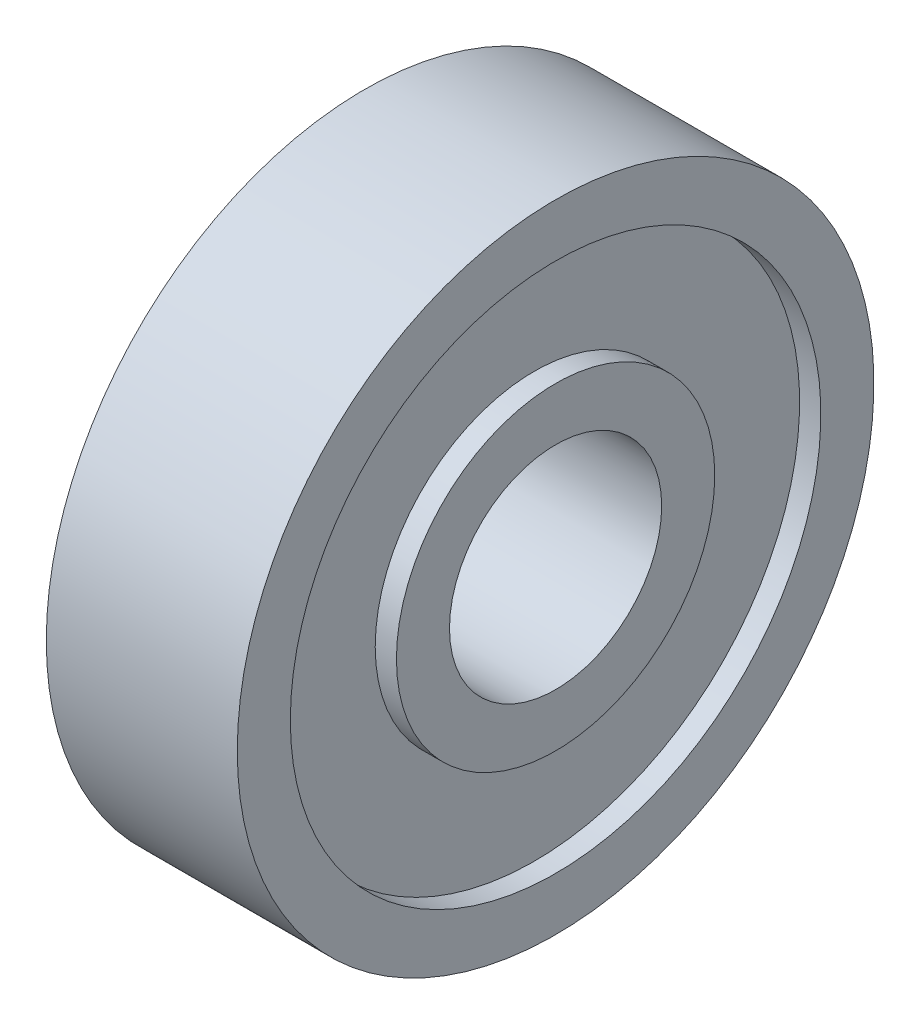
ISO-10303-21;
HEADER;
FILE_DESCRIPTION(('STEP AP214'),'2;1');
FILE_NAME('part.step','',(''),(''),'','','');
FILE_SCHEMA(('AUTOMOTIVE_DESIGN { 1 0 10303 214 1 1 1 1 }'));
ENDSEC;
DATA;
#1=APPLICATION_CONTEXT('core data for automotive mechanical design processes');
#2=APPLICATION_PROTOCOL_DEFINITION('international standard','automotive_design',2000,#1);
#3=PRODUCT_CONTEXT('',#1,'mechanical');
#4=PRODUCT('Part','Part','',(#3));
#5=PRODUCT_RELATED_PRODUCT_CATEGORY('part','',(#4));
#6=PRODUCT_DEFINITION_FORMATION('','',#4);
#7=PRODUCT_DEFINITION_CONTEXT('part definition',#1,'design');
#8=PRODUCT_DEFINITION('design','',#6,#7);
#9=PRODUCT_DEFINITION_SHAPE('','',#8);
#10=(LENGTH_UNIT() NAMED_UNIT(*) SI_UNIT(.MILLI.,.METRE.));
#11=(NAMED_UNIT(*) PLANE_ANGLE_UNIT() SI_UNIT($,.RADIAN.));
#12=(NAMED_UNIT(*) SI_UNIT($,.STERADIAN.) SOLID_ANGLE_UNIT());
#13=UNCERTAINTY_MEASURE_WITH_UNIT(LENGTH_MEASURE(1.E-05),#10,'distance_accuracy_value','');
#14=(GEOMETRIC_REPRESENTATION_CONTEXT(3) GLOBAL_UNCERTAINTY_ASSIGNED_CONTEXT((#13)) GLOBAL_UNIT_ASSIGNED_CONTEXT((#10,
#11,#12)) REPRESENTATION_CONTEXT('',''));
#15=CARTESIAN_POINT('',(0.,0.,0.));
#16=DIRECTION('',(0.,0.,1.));
#17=DIRECTION('',(1.,0.,0.));
#18=AXIS2_PLACEMENT_3D('',#15,#16,#17);
#19=CARTESIAN_POINT('',(-243.027564124036,0.,0.));
#20=DIRECTION('',(-1.,0.,0.));
#21=DIRECTION('',(0.,0.,1.));
#22=AXIS2_PLACEMENT_3D('',#19,#20,#21);
#23=CYLINDRICAL_SURFACE('',#22,5.00000000000024);
#24=CARTESIAN_POINT('',(4.5,0.,0.));
#25=DIRECTION('',(-1.,0.,0.));
#26=DIRECTION('',(0.,0.,1.));
#27=AXIS2_PLACEMENT_3D('',#24,#25,#26);
#28=CIRCLE('',#27,5.);
#29=CARTESIAN_POINT('',(4.5,0.,5.));
#30=VERTEX_POINT('',#29);
#31=EDGE_CURVE('E10',#30,#30,#28,.T.);
#32=ORIENTED_EDGE('',*,*,#31,.F.);
#33=EDGE_LOOP('',(#32));
#34=FACE_BOUND('',#33,.T.);
#35=CARTESIAN_POINT('',(-4.5,0.,0.));
#36=DIRECTION('',(-1.,0.,0.));
#37=DIRECTION('',(0.,0.,1.));
#38=AXIS2_PLACEMENT_3D('',#35,#36,#37);
#39=CIRCLE('',#38,5.);
#40=CARTESIAN_POINT('',(-4.5,0.,5.));
#41=VERTEX_POINT('',#40);
#42=EDGE_CURVE('E74',#41,#41,#39,.T.);
#43=ORIENTED_EDGE('',*,*,#42,.T.);
#44=EDGE_LOOP('',(#43));
#45=FACE_BOUND('',#44,.T.);
#46=ADVANCED_FACE('F43',(#34,#45),#23,.F.);
#47=CARTESIAN_POINT('',(4.5,5.,0.));
#48=DIRECTION('',(-1.,0.,0.));
#49=DIRECTION('',(0.,0.,1.));
#50=AXIS2_PLACEMENT_3D('',#47,#48,#49);
#51=PLANE('',#50);
#52=CARTESIAN_POINT('',(4.5,0.,0.));
#53=DIRECTION('',(-1.,0.,0.));
#54=DIRECTION('',(0.,0.,1.));
#55=AXIS2_PLACEMENT_3D('',#52,#53,#54);
#56=CIRCLE('',#55,7.5);
#57=CARTESIAN_POINT('',(4.5,0.,7.5));
#58=VERTEX_POINT('',#57);
#59=EDGE_CURVE('E50',#58,#58,#56,.T.);
#60=ORIENTED_EDGE('',*,*,#59,.F.);
#61=EDGE_LOOP('',(#60));
#62=FACE_BOUND('',#61,.T.);
#63=ORIENTED_EDGE('',*,*,#31,.T.);
#64=EDGE_LOOP('',(#63));
#65=FACE_BOUND('',#64,.T.);
#66=ADVANCED_FACE('F119',(#62,#65),#51,.F.);
#67=CARTESIAN_POINT('',(-243.027564124036,0.,0.));
#68=DIRECTION('',(-1.,0.,0.));
#69=DIRECTION('',(0.,0.,1.));
#70=AXIS2_PLACEMENT_3D('',#67,#68,#69);
#71=CYLINDRICAL_SURFACE('',#70,7.5);
#72=CARTESIAN_POINT('',(3.5,0.,0.));
#73=DIRECTION('',(-1.,0.,0.));
#74=DIRECTION('',(0.,0.,1.));
#75=AXIS2_PLACEMENT_3D('',#72,#73,#74);
#76=CIRCLE('',#75,7.5);
#77=CARTESIAN_POINT('',(3.5,0.,7.5));
#78=VERTEX_POINT('',#77);
#79=EDGE_CURVE('E55',#78,#78,#76,.T.);
#80=ORIENTED_EDGE('',*,*,#79,.F.);
#81=EDGE_LOOP('',(#80));
#82=FACE_BOUND('',#81,.T.);
#83=ORIENTED_EDGE('',*,*,#59,.T.);
#84=EDGE_LOOP('',(#83));
#85=FACE_BOUND('',#84,.T.);
#86=ADVANCED_FACE('F124',(#82,#85),#71,.T.);
#87=CARTESIAN_POINT('',(3.5,7.5,0.));
#88=DIRECTION('',(-1.,0.,0.));
#89=DIRECTION('',(0.,0.,1.));
#90=AXIS2_PLACEMENT_3D('',#87,#88,#89);
#91=PLANE('',#90);
#92=CARTESIAN_POINT('',(3.5,0.,0.));
#93=DIRECTION('',(-1.,0.,0.));
#94=DIRECTION('',(0.,0.,1.));
#95=AXIS2_PLACEMENT_3D('',#92,#93,#94);
#96=CIRCLE('',#95,12.5);
#97=CARTESIAN_POINT('',(3.5,0.,12.5));
#98=VERTEX_POINT('',#97);
#99=EDGE_CURVE('E60',#98,#98,#96,.T.);
#100=ORIENTED_EDGE('',*,*,#99,.F.);
#101=EDGE_LOOP('',(#100));
#102=FACE_BOUND('',#101,.T.);
#103=ORIENTED_EDGE('',*,*,#79,.T.);
#104=EDGE_LOOP('',(#103));
#105=FACE_BOUND('',#104,.T.);
#106=ADVANCED_FACE('F132',(#102,#105),#91,.F.);
#107=CARTESIAN_POINT('',(-243.027564124036,0.,0.));
#108=DIRECTION('',(-1.,0.,0.));
#109=DIRECTION('',(0.,0.,1.));
#110=AXIS2_PLACEMENT_3D('',#107,#108,#109);
#111=CYLINDRICAL_SURFACE('',#110,12.5);
#112=CARTESIAN_POINT('',(4.5,0.,0.));
#113=DIRECTION('',(-1.,0.,0.));
#114=DIRECTION('',(0.,0.,1.));
#115=AXIS2_PLACEMENT_3D('',#112,#113,#114);
#116=CIRCLE('',#115,12.5);
#117=CARTESIAN_POINT('',(4.5,0.,12.5));
#118=VERTEX_POINT('',#117);
#119=EDGE_CURVE('E66',#118,#118,#116,.T.);
#120=ORIENTED_EDGE('',*,*,#119,.F.);
#121=EDGE_LOOP('',(#120));
#122=FACE_BOUND('',#121,.T.);
#123=ORIENTED_EDGE('',*,*,#99,.T.);
#124=EDGE_LOOP('',(#123));
#125=FACE_BOUND('',#124,.T.);
#126=ADVANCED_FACE('F115',(#122,#125),#111,.F.);
#127=CARTESIAN_POINT('',(4.5,12.5,0.));
#128=DIRECTION('',(-1.,0.,0.));
#129=DIRECTION('',(0.,0.,1.));
#130=AXIS2_PLACEMENT_3D('',#127,#128,#129);
#131=PLANE('',#130);
#132=CARTESIAN_POINT('',(4.5,0.,0.));
#133=DIRECTION('',(-1.,0.,0.));
#134=DIRECTION('',(0.,0.,1.));
#135=AXIS2_PLACEMENT_3D('',#132,#133,#134);
#136=CIRCLE('',#135,15.);
#137=CARTESIAN_POINT('',(4.5,0.,15.));
#138=VERTEX_POINT('',#137);
#139=EDGE_CURVE('E70',#138,#138,#136,.T.);
#140=ORIENTED_EDGE('',*,*,#139,.F.);
#141=EDGE_LOOP('',(#140));
#142=FACE_BOUND('',#141,.T.);
#143=ORIENTED_EDGE('',*,*,#119,.T.);
#144=EDGE_LOOP('',(#143));
#145=FACE_BOUND('',#144,.T.);
#146=ADVANCED_FACE('F105',(#142,#145),#131,.F.);
#147=CARTESIAN_POINT('',(-243.027564124036,0.,0.));
#148=DIRECTION('',(-1.,0.,0.));
#149=DIRECTION('',(0.,0.,1.));
#150=AXIS2_PLACEMENT_3D('',#147,#148,#149);
#151=CYLINDRICAL_SURFACE('',#150,15.);
#152=ORIENTED_EDGE('',*,*,#139,.T.);
#153=EDGE_LOOP('',(#152));
#154=FACE_BOUND('',#153,.T.);
#155=CARTESIAN_POINT('',(-4.5,0.,0.));
#156=DIRECTION('',(-1.,0.,0.));
#157=DIRECTION('',(0.,0.,1.));
#158=AXIS2_PLACEMENT_3D('',#155,#156,#157);
#159=CIRCLE('',#158,15.);
#160=CARTESIAN_POINT('',(-4.5,0.,15.));
#161=VERTEX_POINT('',#160);
#162=EDGE_CURVE('E94',#161,#161,#159,.T.);
#163=ORIENTED_EDGE('',*,*,#162,.F.);
#164=EDGE_LOOP('',(#163));
#165=FACE_BOUND('',#164,.T.);
#166=ADVANCED_FACE('F102',(#154,#165),#151,.T.);
#167=CARTESIAN_POINT('',(-4.5,5.,0.));
#168=DIRECTION('',(1.,0.,0.));
#169=DIRECTION('',(0.,0.,1.));
#170=AXIS2_PLACEMENT_3D('',#167,#168,#169);
#171=PLANE('',#170);
#172=CARTESIAN_POINT('',(-4.5,0.,0.));
#173=DIRECTION('',(-1.,0.,0.));
#174=DIRECTION('',(0.,0.,1.));
#175=AXIS2_PLACEMENT_3D('',#172,#173,#174);
#176=CIRCLE('',#175,7.5);
#177=CARTESIAN_POINT('',(-4.5,0.,7.5));
#178=VERTEX_POINT('',#177);
#179=EDGE_CURVE('E78',#178,#178,#176,.T.);
#180=ORIENTED_EDGE('',*,*,#179,.T.);
#181=EDGE_LOOP('',(#180));
#182=FACE_BOUND('',#181,.T.);
#183=ORIENTED_EDGE('',*,*,#42,.F.);
#184=EDGE_LOOP('',(#183));
#185=FACE_BOUND('',#184,.T.);
#186=ADVANCED_FACE('F104',(#182,#185),#171,.F.);
#187=CARTESIAN_POINT('',(243.027564124036,0.,0.));
#188=DIRECTION('',(1.,0.,0.));
#189=DIRECTION('',(0.,0.,1.));
#190=AXIS2_PLACEMENT_3D('',#187,#188,#189);
#191=CYLINDRICAL_SURFACE('',#190,7.5);
#192=CARTESIAN_POINT('',(-3.5,0.,0.));
#193=DIRECTION('',(-1.,0.,0.));
#194=DIRECTION('',(0.,0.,1.));
#195=AXIS2_PLACEMENT_3D('',#192,#193,#194);
#196=CIRCLE('',#195,7.5);
#197=CARTESIAN_POINT('',(-3.5,0.,7.5));
#198=VERTEX_POINT('',#197);
#199=EDGE_CURVE('E82',#198,#198,#196,.T.);
#200=ORIENTED_EDGE('',*,*,#199,.T.);
#201=EDGE_LOOP('',(#200));
#202=FACE_BOUND('',#201,.T.);
#203=ORIENTED_EDGE('',*,*,#179,.F.);
#204=EDGE_LOOP('',(#203));
#205=FACE_BOUND('',#204,.T.);
#206=ADVANCED_FACE('F112',(#202,#205),#191,.T.);
#207=CARTESIAN_POINT('',(-3.5,7.5,0.));
#208=DIRECTION('',(1.,0.,0.));
#209=DIRECTION('',(0.,0.,1.));
#210=AXIS2_PLACEMENT_3D('',#207,#208,#209);
#211=PLANE('',#210);
#212=CARTESIAN_POINT('',(-3.5,0.,0.));
#213=DIRECTION('',(-1.,0.,0.));
#214=DIRECTION('',(0.,0.,1.));
#215=AXIS2_PLACEMENT_3D('',#212,#213,#214);
#216=CIRCLE('',#215,12.5);
#217=CARTESIAN_POINT('',(-3.5,0.,12.5));
#218=VERTEX_POINT('',#217);
#219=EDGE_CURVE('E86',#218,#218,#216,.T.);
#220=ORIENTED_EDGE('',*,*,#219,.T.);
#221=EDGE_LOOP('',(#220));
#222=FACE_BOUND('',#221,.T.);
#223=ORIENTED_EDGE('',*,*,#199,.F.);
#224=EDGE_LOOP('',(#223));
#225=FACE_BOUND('',#224,.T.);
#226=ADVANCED_FACE('F183',(#222,#225),#211,.F.);
#227=CARTESIAN_POINT('',(243.027564124036,0.,0.));
#228=DIRECTION('',(1.,0.,0.));
#229=DIRECTION('',(0.,0.,1.));
#230=AXIS2_PLACEMENT_3D('',#227,#228,#229);
#231=CYLINDRICAL_SURFACE('',#230,12.5);
#232=CARTESIAN_POINT('',(-4.5,0.,0.));
#233=DIRECTION('',(-1.,0.,0.));
#234=DIRECTION('',(0.,0.,1.));
#235=AXIS2_PLACEMENT_3D('',#232,#233,#234);
#236=CIRCLE('',#235,12.5);
#237=CARTESIAN_POINT('',(-4.5,0.,12.5));
#238=VERTEX_POINT('',#237);
#239=EDGE_CURVE('E90',#238,#238,#236,.T.);
#240=ORIENTED_EDGE('',*,*,#239,.T.);
#241=EDGE_LOOP('',(#240));
#242=FACE_BOUND('',#241,.T.);
#243=ORIENTED_EDGE('',*,*,#219,.F.);
#244=EDGE_LOOP('',(#243));
#245=FACE_BOUND('',#244,.T.);
#246=ADVANCED_FACE('F195',(#242,#245),#231,.F.);
#247=CARTESIAN_POINT('',(-4.5,12.5,0.));
#248=DIRECTION('',(1.,0.,0.));
#249=DIRECTION('',(0.,0.,1.));
#250=AXIS2_PLACEMENT_3D('',#247,#248,#249);
#251=PLANE('',#250);
#252=ORIENTED_EDGE('',*,*,#162,.T.);
#253=EDGE_LOOP('',(#252));
#254=FACE_BOUND('',#253,.T.);
#255=ORIENTED_EDGE('',*,*,#239,.F.);
#256=EDGE_LOOP('',(#255));
#257=FACE_BOUND('',#256,.T.);
#258=ADVANCED_FACE('F99',(#254,#257),#251,.F.);
#259=CLOSED_SHELL('',(#46,#66,#86,#106,#126,#146,#166,#186,#206,#226,#246,#258));
#260=MANIFOLD_SOLID_BREP('B2',#259);
#261=ADVANCED_BREP_SHAPE_REPRESENTATION('',(#18,#260),#14);
#262=SHAPE_DEFINITION_REPRESENTATION(#9,#261);
ENDSEC;
END-ISO-10303-21;
